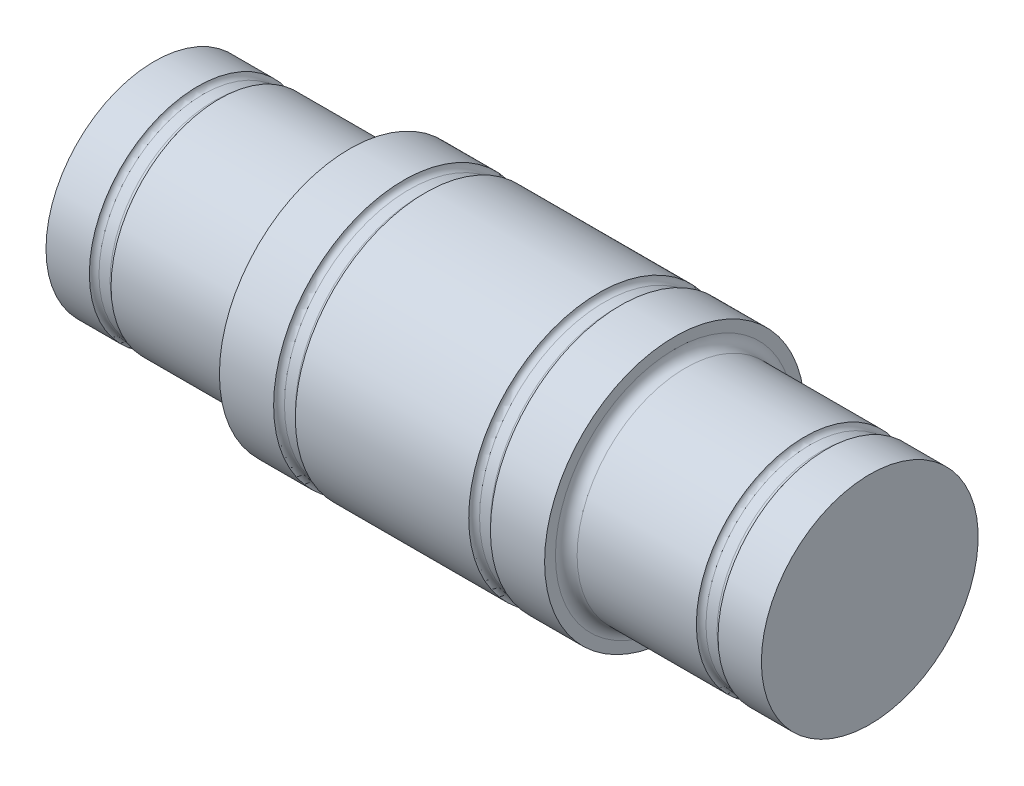
ISO-10303-21;
HEADER;
FILE_DESCRIPTION(('STEP AP214'),'2;1');
FILE_NAME('part.step','',(''),(''),'','','');
FILE_SCHEMA(('AUTOMOTIVE_DESIGN { 1 0 10303 214 1 1 1 1 }'));
ENDSEC;
DATA;
#1=APPLICATION_CONTEXT('core data for automotive mechanical design processes');
#2=APPLICATION_PROTOCOL_DEFINITION('international standard','automotive_design',2000,#1);
#3=PRODUCT_CONTEXT('',#1,'mechanical');
#4=PRODUCT('Part','Part','',(#3));
#5=PRODUCT_RELATED_PRODUCT_CATEGORY('part','',(#4));
#6=PRODUCT_DEFINITION_FORMATION('','',#4);
#7=PRODUCT_DEFINITION_CONTEXT('part definition',#1,'design');
#8=PRODUCT_DEFINITION('design','',#6,#7);
#9=PRODUCT_DEFINITION_SHAPE('','',#8);
#10=(LENGTH_UNIT() NAMED_UNIT(*) SI_UNIT(.MILLI.,.METRE.));
#11=(NAMED_UNIT(*) PLANE_ANGLE_UNIT() SI_UNIT($,.RADIAN.));
#12=(NAMED_UNIT(*) SI_UNIT($,.STERADIAN.) SOLID_ANGLE_UNIT());
#13=UNCERTAINTY_MEASURE_WITH_UNIT(LENGTH_MEASURE(1.E-05),#10,'distance_accuracy_value','');
#14=(GEOMETRIC_REPRESENTATION_CONTEXT(3) GLOBAL_UNCERTAINTY_ASSIGNED_CONTEXT((#13)) GLOBAL_UNIT_ASSIGNED_CONTEXT((#10,
#11,#12)) REPRESENTATION_CONTEXT('',''));
#15=CARTESIAN_POINT('',(0.,0.,0.));
#16=DIRECTION('',(0.,0.,1.));
#17=DIRECTION('',(1.,0.,0.));
#18=AXIS2_PLACEMENT_3D('',#15,#16,#17);
#19=CARTESIAN_POINT('',(-16.5,5.,0.));
#20=DIRECTION('',(1.,0.,0.));
#21=DIRECTION('',(0.,0.,-1.));
#22=AXIS2_PLACEMENT_3D('',#19,#20,#21);
#23=PLANE('',#22);
#24=CARTESIAN_POINT('',(-16.5,0.,0.));
#25=DIRECTION('',(-1.,0.,0.));
#26=DIRECTION('',(0.,0.,1.));
#27=AXIS2_PLACEMENT_3D('',#24,#25,#26);
#28=CIRCLE('',#27,5.);
#29=CARTESIAN_POINT('',(-16.5,0.,5.));
#30=VERTEX_POINT('',#29);
#31=EDGE_CURVE('E123',#30,#30,#28,.T.);
#32=ORIENTED_EDGE('',*,*,#31,.T.);
#33=EDGE_LOOP('',(#32));
#34=FACE_BOUND('',#33,.T.);
#35=ADVANCED_FACE('F46',(#34),#23,.F.);
#36=CARTESIAN_POINT('',(16.5,0.,0.));
#37=DIRECTION('',(-1.,0.,0.));
#38=DIRECTION('',(0.,0.,1.));
#39=AXIS2_PLACEMENT_3D('',#36,#37,#38);
#40=PLANE('',#39);
#41=CARTESIAN_POINT('',(16.5,0.,0.));
#42=DIRECTION('',(-1.,0.,0.));
#43=DIRECTION('',(0.,0.,1.));
#44=AXIS2_PLACEMENT_3D('',#41,#42,#43);
#45=CIRCLE('',#44,5.);
#46=CARTESIAN_POINT('',(16.5,0.,5.));
#47=VERTEX_POINT('',#46);
#48=EDGE_CURVE('E90',#47,#47,#45,.T.);
#49=ORIENTED_EDGE('',*,*,#48,.F.);
#50=EDGE_LOOP('',(#49));
#51=FACE_BOUND('',#50,.T.);
#52=ADVANCED_FACE('F145',(#51),#40,.F.);
#53=CARTESIAN_POINT('',(-16.5,0.,0.));
#54=DIRECTION('',(-1.,0.,0.));
#55=DIRECTION('',(0.,0.,1.));
#56=AXIS2_PLACEMENT_3D('',#53,#54,#55);
#57=CYLINDRICAL_SURFACE('',#56,5.);
#58=CARTESIAN_POINT('',(14.5,0.,0.));
#59=DIRECTION('',(-1.,0.,0.));
#60=DIRECTION('',(0.,0.,1.));
#61=AXIS2_PLACEMENT_3D('',#58,#59,#60);
#62=CIRCLE('',#61,5.);
#63=CARTESIAN_POINT('',(14.5,0.,5.));
#64=VERTEX_POINT('',#63);
#65=EDGE_CURVE('E93',#64,#64,#62,.T.);
#66=ORIENTED_EDGE('',*,*,#65,.F.);
#67=EDGE_LOOP('',(#66));
#68=FACE_BOUND('',#67,.T.);
#69=ORIENTED_EDGE('',*,*,#48,.T.);
#70=EDGE_LOOP('',(#69));
#71=FACE_BOUND('',#70,.T.);
#72=ADVANCED_FACE('F150',(#68,#71),#57,.T.);
#73=CARTESIAN_POINT('',(-16.5,0.,0.));
#74=DIRECTION('',(-1.,0.,0.));
#75=DIRECTION('',(0.,0.,1.));
#76=AXIS2_PLACEMENT_3D('',#73,#74,#75);
#77=CYLINDRICAL_SURFACE('',#76,4.8);
#78=CARTESIAN_POINT('',(14.2550510257217,0.,0.));
#79=DIRECTION('',(1.,0.,0.));
#80=DIRECTION('',(0.,0.,-1.));
#81=AXIS2_PLACEMENT_3D('',#78,#79,#80);
#82=CIRCLE('',#81,4.8);
#83=CARTESIAN_POINT('',(14.2550510257217,0.,-4.8));
#84=VERTEX_POINT('',#83);
#85=EDGE_CURVE('E57',#84,#84,#82,.F.);
#86=ORIENTED_EDGE('',*,*,#85,.T.);
#87=EDGE_LOOP('',(#86));
#88=FACE_BOUND('',#87,.T.);
#89=CARTESIAN_POINT('',(13.7449489742783,0.,0.));
#90=DIRECTION('',(-1.,0.,0.));
#91=DIRECTION('',(0.,0.,1.));
#92=AXIS2_PLACEMENT_3D('',#89,#90,#91);
#93=CIRCLE('',#92,4.8);
#94=CARTESIAN_POINT('',(13.7449489742783,0.,4.8));
#95=VERTEX_POINT('',#94);
#96=EDGE_CURVE('E61',#95,#95,#93,.F.);
#97=ORIENTED_EDGE('',*,*,#96,.T.);
#98=EDGE_LOOP('',(#97));
#99=FACE_BOUND('',#98,.T.);
#100=ADVANCED_FACE('F193',(#88,#99),#77,.T.);
#101=CARTESIAN_POINT('',(-16.5,0.,0.));
#102=DIRECTION('',(-1.,0.,0.));
#103=DIRECTION('',(0.,0.,1.));
#104=AXIS2_PLACEMENT_3D('',#101,#102,#103);
#105=CYLINDRICAL_SURFACE('',#104,5.);
#106=CARTESIAN_POINT('',(8.,0.,0.));
#107=DIRECTION('',(-1.,0.,0.));
#108=DIRECTION('',(0.,0.,1.));
#109=AXIS2_PLACEMENT_3D('',#106,#107,#108);
#110=CIRCLE('',#109,5.);
#111=CARTESIAN_POINT('',(8.,0.,5.));
#112=VERTEX_POINT('',#111);
#113=EDGE_CURVE('E84',#112,#112,#110,.F.);
#114=ORIENTED_EDGE('',*,*,#113,.T.);
#115=EDGE_LOOP('',(#114));
#116=FACE_BOUND('',#115,.T.);
#117=CARTESIAN_POINT('',(13.5,0.,0.));
#118=DIRECTION('',(-1.,0.,0.));
#119=DIRECTION('',(0.,0.,1.));
#120=AXIS2_PLACEMENT_3D('',#117,#118,#119);
#121=CIRCLE('',#120,5.);
#122=CARTESIAN_POINT('',(13.5,0.,5.));
#123=VERTEX_POINT('',#122);
#124=EDGE_CURVE('E96',#123,#123,#121,.T.);
#125=ORIENTED_EDGE('',*,*,#124,.T.);
#126=EDGE_LOOP('',(#125));
#127=FACE_BOUND('',#126,.T.);
#128=ADVANCED_FACE('F190',(#116,#127),#105,.T.);
#129=CARTESIAN_POINT('',(7.5,5.,0.));
#130=DIRECTION('',(-1.,0.,0.));
#131=DIRECTION('',(0.,0.,1.));
#132=AXIS2_PLACEMENT_3D('',#129,#130,#131);
#133=PLANE('',#132);
#134=CARTESIAN_POINT('',(7.5,0.,0.));
#135=DIRECTION('',(-1.,0.,0.));
#136=DIRECTION('',(0.,0.,1.));
#137=AXIS2_PLACEMENT_3D('',#134,#135,#136);
#138=CIRCLE('',#137,5.5);
#139=CARTESIAN_POINT('',(7.5,0.,5.5));
#140=VERTEX_POINT('',#139);
#141=EDGE_CURVE('E87',#140,#140,#138,.T.);
#142=ORIENTED_EDGE('',*,*,#141,.T.);
#143=EDGE_LOOP('',(#142));
#144=FACE_BOUND('',#143,.T.);
#145=CARTESIAN_POINT('',(7.5,0.,0.));
#146=DIRECTION('',(-1.,0.,0.));
#147=DIRECTION('',(0.,0.,1.));
#148=AXIS2_PLACEMENT_3D('',#145,#146,#147);
#149=CIRCLE('',#148,6.);
#150=CARTESIAN_POINT('',(7.5,0.,6.));
#151=VERTEX_POINT('',#150);
#152=EDGE_CURVE('E99',#151,#151,#149,.T.);
#153=ORIENTED_EDGE('',*,*,#152,.F.);
#154=EDGE_LOOP('',(#153));
#155=FACE_BOUND('',#154,.T.);
#156=ADVANCED_FACE('F192',(#144,#155),#133,.F.);
#157=CARTESIAN_POINT('',(-16.5,0.,0.));
#158=DIRECTION('',(-1.,0.,0.));
#159=DIRECTION('',(0.,0.,1.));
#160=AXIS2_PLACEMENT_3D('',#157,#158,#159);
#161=CYLINDRICAL_SURFACE('',#160,6.);
#162=CARTESIAN_POINT('',(5.,0.,0.));
#163=DIRECTION('',(-1.,0.,0.));
#164=DIRECTION('',(0.,0.,1.));
#165=AXIS2_PLACEMENT_3D('',#162,#163,#164);
#166=CIRCLE('',#165,6.);
#167=CARTESIAN_POINT('',(5.,0.,6.));
#168=VERTEX_POINT('',#167);
#169=EDGE_CURVE('E102',#168,#168,#166,.T.);
#170=ORIENTED_EDGE('',*,*,#169,.F.);
#171=EDGE_LOOP('',(#170));
#172=FACE_BOUND('',#171,.T.);
#173=ORIENTED_EDGE('',*,*,#152,.T.);
#174=EDGE_LOOP('',(#173));
#175=FACE_BOUND('',#174,.T.);
#176=ADVANCED_FACE('F200',(#172,#175),#161,.T.);
#177=CARTESIAN_POINT('',(-16.5,0.,0.));
#178=DIRECTION('',(-1.,0.,0.));
#179=DIRECTION('',(0.,0.,1.));
#180=AXIS2_PLACEMENT_3D('',#177,#178,#179);
#181=CYLINDRICAL_SURFACE('',#180,5.75);
#182=CARTESIAN_POINT('',(4.25,0.,0.));
#183=DIRECTION('',(-1.,0.,0.));
#184=DIRECTION('',(0.,0.,1.));
#185=AXIS2_PLACEMENT_3D('',#182,#183,#184);
#186=CIRCLE('',#185,5.75);
#187=CARTESIAN_POINT('',(4.25,0.,5.75));
#188=VERTEX_POINT('',#187);
#189=EDGE_CURVE('E66',#188,#188,#186,.F.);
#190=ORIENTED_EDGE('',*,*,#189,.T.);
#191=EDGE_LOOP('',(#190));
#192=FACE_BOUND('',#191,.T.);
#193=CARTESIAN_POINT('',(4.75,0.,0.));
#194=DIRECTION('',(1.,0.,0.));
#195=DIRECTION('',(0.,0.,-1.));
#196=AXIS2_PLACEMENT_3D('',#193,#194,#195);
#197=CIRCLE('',#196,5.75);
#198=CARTESIAN_POINT('',(4.75,0.,-5.75));
#199=VERTEX_POINT('',#198);
#200=EDGE_CURVE('E69',#199,#199,#197,.F.);
#201=ORIENTED_EDGE('',*,*,#200,.T.);
#202=EDGE_LOOP('',(#201));
#203=FACE_BOUND('',#202,.T.);
#204=ADVANCED_FACE('F308',(#192,#203),#181,.T.);
#205=CARTESIAN_POINT('',(-16.5,0.,0.));
#206=DIRECTION('',(-1.,0.,0.));
#207=DIRECTION('',(0.,0.,1.));
#208=AXIS2_PLACEMENT_3D('',#205,#206,#207);
#209=CYLINDRICAL_SURFACE('',#208,6.);
#210=CARTESIAN_POINT('',(-4.,0.,0.));
#211=DIRECTION('',(-1.,0.,0.));
#212=DIRECTION('',(0.,0.,1.));
#213=AXIS2_PLACEMENT_3D('',#210,#211,#212);
#214=CIRCLE('',#213,6.);
#215=CARTESIAN_POINT('',(-4.,0.,6.));
#216=VERTEX_POINT('',#215);
#217=EDGE_CURVE('E108',#216,#216,#214,.T.);
#218=ORIENTED_EDGE('',*,*,#217,.F.);
#219=EDGE_LOOP('',(#218));
#220=FACE_BOUND('',#219,.T.);
#221=CARTESIAN_POINT('',(4.,0.,0.));
#222=DIRECTION('',(-1.,0.,0.));
#223=DIRECTION('',(0.,0.,1.));
#224=AXIS2_PLACEMENT_3D('',#221,#222,#223);
#225=CIRCLE('',#224,6.);
#226=CARTESIAN_POINT('',(4.,0.,6.));
#227=VERTEX_POINT('',#226);
#228=EDGE_CURVE('E105',#227,#227,#225,.T.);
#229=ORIENTED_EDGE('',*,*,#228,.T.);
#230=EDGE_LOOP('',(#229));
#231=FACE_BOUND('',#230,.T.);
#232=ADVANCED_FACE('F314',(#220,#231),#209,.T.);
#233=CARTESIAN_POINT('',(-16.5,0.,0.));
#234=DIRECTION('',(-1.,0.,0.));
#235=DIRECTION('',(0.,0.,1.));
#236=AXIS2_PLACEMENT_3D('',#233,#234,#235);
#237=CYLINDRICAL_SURFACE('',#236,5.75);
#238=CARTESIAN_POINT('',(-4.25,0.,0.));
#239=DIRECTION('',(1.,0.,0.));
#240=DIRECTION('',(0.,0.,-1.));
#241=AXIS2_PLACEMENT_3D('',#238,#239,#240);
#242=CIRCLE('',#241,5.75);
#243=CARTESIAN_POINT('',(-4.25,0.,-5.75));
#244=VERTEX_POINT('',#243);
#245=EDGE_CURVE('E72',#244,#244,#242,.F.);
#246=ORIENTED_EDGE('',*,*,#245,.T.);
#247=EDGE_LOOP('',(#246));
#248=FACE_BOUND('',#247,.T.);
#249=CARTESIAN_POINT('',(-4.75,0.,0.));
#250=DIRECTION('',(-1.,0.,0.));
#251=DIRECTION('',(0.,0.,1.));
#252=AXIS2_PLACEMENT_3D('',#249,#250,#251);
#253=CIRCLE('',#252,5.75);
#254=CARTESIAN_POINT('',(-4.75,0.,5.75));
#255=VERTEX_POINT('',#254);
#256=EDGE_CURVE('E75',#255,#255,#253,.F.);
#257=ORIENTED_EDGE('',*,*,#256,.T.);
#258=EDGE_LOOP('',(#257));
#259=FACE_BOUND('',#258,.T.);
#260=ADVANCED_FACE('F321',(#248,#259),#237,.T.);
#261=CARTESIAN_POINT('',(-16.5,0.,0.));
#262=DIRECTION('',(-1.,0.,0.));
#263=DIRECTION('',(0.,0.,1.));
#264=AXIS2_PLACEMENT_3D('',#261,#262,#263);
#265=CYLINDRICAL_SURFACE('',#264,6.);
#266=CARTESIAN_POINT('',(-7.5,0.,0.));
#267=DIRECTION('',(-1.,0.,0.));
#268=DIRECTION('',(0.,0.,1.));
#269=AXIS2_PLACEMENT_3D('',#266,#267,#268);
#270=CIRCLE('',#269,6.);
#271=CARTESIAN_POINT('',(-7.5,0.,6.));
#272=VERTEX_POINT('',#271);
#273=EDGE_CURVE('E114',#272,#272,#270,.T.);
#274=ORIENTED_EDGE('',*,*,#273,.F.);
#275=EDGE_LOOP('',(#274));
#276=FACE_BOUND('',#275,.T.);
#277=CARTESIAN_POINT('',(-5.,0.,0.));
#278=DIRECTION('',(-1.,0.,0.));
#279=DIRECTION('',(0.,0.,1.));
#280=AXIS2_PLACEMENT_3D('',#277,#278,#279);
#281=CIRCLE('',#280,6.);
#282=CARTESIAN_POINT('',(-5.,0.,6.));
#283=VERTEX_POINT('',#282);
#284=EDGE_CURVE('E111',#283,#283,#281,.T.);
#285=ORIENTED_EDGE('',*,*,#284,.T.);
#286=EDGE_LOOP('',(#285));
#287=FACE_BOUND('',#286,.T.);
#288=ADVANCED_FACE('F286',(#276,#287),#265,.T.);
#289=CARTESIAN_POINT('',(-7.5,6.,0.));
#290=DIRECTION('',(1.,0.,0.));
#291=DIRECTION('',(0.,0.,-1.));
#292=AXIS2_PLACEMENT_3D('',#289,#290,#291);
#293=PLANE('',#292);
#294=CARTESIAN_POINT('',(-7.5,0.,0.));
#295=DIRECTION('',(1.,0.,0.));
#296=DIRECTION('',(0.,0.,-1.));
#297=AXIS2_PLACEMENT_3D('',#294,#295,#296);
#298=CIRCLE('',#297,5.5);
#299=CARTESIAN_POINT('',(-7.5,0.,-5.5));
#300=VERTEX_POINT('',#299);
#301=EDGE_CURVE('E78',#300,#300,#298,.T.);
#302=ORIENTED_EDGE('',*,*,#301,.T.);
#303=EDGE_LOOP('',(#302));
#304=FACE_BOUND('',#303,.T.);
#305=ORIENTED_EDGE('',*,*,#273,.T.);
#306=EDGE_LOOP('',(#305));
#307=FACE_BOUND('',#306,.T.);
#308=ADVANCED_FACE('F228',(#304,#307),#293,.F.);
#309=CARTESIAN_POINT('',(-16.5,0.,0.));
#310=DIRECTION('',(-1.,0.,0.));
#311=DIRECTION('',(0.,0.,1.));
#312=AXIS2_PLACEMENT_3D('',#309,#310,#311);
#313=CYLINDRICAL_SURFACE('',#312,5.);
#314=CARTESIAN_POINT('',(-8.,0.,0.));
#315=DIRECTION('',(1.,0.,0.));
#316=DIRECTION('',(0.,0.,-1.));
#317=AXIS2_PLACEMENT_3D('',#314,#315,#316);
#318=CIRCLE('',#317,5.);
#319=CARTESIAN_POINT('',(-8.,0.,-5.));
#320=VERTEX_POINT('',#319);
#321=EDGE_CURVE('E81',#320,#320,#318,.F.);
#322=ORIENTED_EDGE('',*,*,#321,.T.);
#323=EDGE_LOOP('',(#322));
#324=FACE_BOUND('',#323,.T.);
#325=CARTESIAN_POINT('',(-13.5,0.,0.));
#326=DIRECTION('',(-1.,0.,0.));
#327=DIRECTION('',(0.,0.,1.));
#328=AXIS2_PLACEMENT_3D('',#325,#326,#327);
#329=CIRCLE('',#328,5.);
#330=CARTESIAN_POINT('',(-13.5,0.,5.));
#331=VERTEX_POINT('',#330);
#332=EDGE_CURVE('E117',#331,#331,#329,.T.);
#333=ORIENTED_EDGE('',*,*,#332,.F.);
#334=EDGE_LOOP('',(#333));
#335=FACE_BOUND('',#334,.T.);
#336=ADVANCED_FACE('F225',(#324,#335),#313,.T.);
#337=CARTESIAN_POINT('',(-16.5,0.,0.));
#338=DIRECTION('',(-1.,0.,0.));
#339=DIRECTION('',(0.,0.,1.));
#340=AXIS2_PLACEMENT_3D('',#337,#338,#339);
#341=CYLINDRICAL_SURFACE('',#340,4.8);
#342=CARTESIAN_POINT('',(-13.7449489742783,0.,0.));
#343=DIRECTION('',(1.,0.,0.));
#344=DIRECTION('',(0.,0.,-1.));
#345=AXIS2_PLACEMENT_3D('',#342,#343,#344);
#346=CIRCLE('',#345,4.8);
#347=CARTESIAN_POINT('',(-13.7449489742783,0.,-4.8));
#348=VERTEX_POINT('',#347);
#349=EDGE_CURVE('E11',#348,#348,#346,.F.);
#350=ORIENTED_EDGE('',*,*,#349,.T.);
#351=EDGE_LOOP('',(#350));
#352=FACE_BOUND('',#351,.T.);
#353=CARTESIAN_POINT('',(-14.2550510257217,0.,0.));
#354=DIRECTION('',(-1.,0.,0.));
#355=DIRECTION('',(0.,0.,1.));
#356=AXIS2_PLACEMENT_3D('',#353,#354,#355);
#357=CIRCLE('',#356,4.8);
#358=CARTESIAN_POINT('',(-14.2550510257217,0.,4.8));
#359=VERTEX_POINT('',#358);
#360=EDGE_CURVE('E53',#359,#359,#357,.F.);
#361=ORIENTED_EDGE('',*,*,#360,.T.);
#362=EDGE_LOOP('',(#361));
#363=FACE_BOUND('',#362,.T.);
#364=ADVANCED_FACE('F132',(#352,#363),#341,.T.);
#365=CARTESIAN_POINT('',(-16.5,0.,0.));
#366=DIRECTION('',(-1.,0.,0.));
#367=DIRECTION('',(0.,0.,1.));
#368=AXIS2_PLACEMENT_3D('',#365,#366,#367);
#369=CYLINDRICAL_SURFACE('',#368,5.);
#370=ORIENTED_EDGE('',*,*,#31,.F.);
#371=EDGE_LOOP('',(#370));
#372=FACE_BOUND('',#371,.T.);
#373=CARTESIAN_POINT('',(-14.5,0.,0.));
#374=DIRECTION('',(-1.,0.,0.));
#375=DIRECTION('',(0.,0.,1.));
#376=AXIS2_PLACEMENT_3D('',#373,#374,#375);
#377=CIRCLE('',#376,5.);
#378=CARTESIAN_POINT('',(-14.5,0.,5.));
#379=VERTEX_POINT('',#378);
#380=EDGE_CURVE('E120',#379,#379,#377,.T.);
#381=ORIENTED_EDGE('',*,*,#380,.T.);
#382=EDGE_LOOP('',(#381));
#383=FACE_BOUND('',#382,.T.);
#384=ADVANCED_FACE('F128',(#372,#383),#369,.T.);
#385=CARTESIAN_POINT('',(8.,0.,0.));
#386=DIRECTION('',(-1.,0.,0.));
#387=DIRECTION('',(0.,0.,1.));
#388=AXIS2_PLACEMENT_3D('',#385,#386,#387);
#389=TOROIDAL_SURFACE('',#388,5.5,0.5);
#390=ORIENTED_EDGE('',*,*,#113,.F.);
#391=EDGE_LOOP('',(#390));
#392=FACE_BOUND('',#391,.T.);
#393=ORIENTED_EDGE('',*,*,#141,.F.);
#394=EDGE_LOOP('',(#393));
#395=FACE_BOUND('',#394,.T.);
#396=ADVANCED_FACE('F131',(#392,#395),#389,.F.);
#397=CARTESIAN_POINT('',(-8.,0.,0.));
#398=DIRECTION('',(1.,0.,0.));
#399=DIRECTION('',(0.,0.,-1.));
#400=AXIS2_PLACEMENT_3D('',#397,#398,#399);
#401=TOROIDAL_SURFACE('',#400,5.5,0.5);
#402=ORIENTED_EDGE('',*,*,#301,.F.);
#403=EDGE_LOOP('',(#402));
#404=FACE_BOUND('',#403,.T.);
#405=ORIENTED_EDGE('',*,*,#321,.F.);
#406=EDGE_LOOP('',(#405));
#407=FACE_BOUND('',#406,.T.);
#408=ADVANCED_FACE('F157',(#404,#407),#401,.F.);
#409=CARTESIAN_POINT('',(-4.25,0.,0.));
#410=DIRECTION('',(1.,0.,0.));
#411=DIRECTION('',(0.,0.,-1.));
#412=AXIS2_PLACEMENT_3D('',#409,#410,#411);
#413=TOROIDAL_SURFACE('',#412,6.,0.25);
#414=ORIENTED_EDGE('',*,*,#217,.T.);
#415=EDGE_LOOP('',(#414));
#416=FACE_BOUND('',#415,.T.);
#417=ORIENTED_EDGE('',*,*,#245,.F.);
#418=EDGE_LOOP('',(#417));
#419=FACE_BOUND('',#418,.T.);
#420=ADVANCED_FACE('F161',(#416,#419),#413,.F.);
#421=CARTESIAN_POINT('',(-4.75,0.,0.));
#422=DIRECTION('',(-1.,0.,0.));
#423=DIRECTION('',(0.,0.,1.));
#424=AXIS2_PLACEMENT_3D('',#421,#422,#423);
#425=TOROIDAL_SURFACE('',#424,6.,0.25);
#426=ORIENTED_EDGE('',*,*,#256,.F.);
#427=EDGE_LOOP('',(#426));
#428=FACE_BOUND('',#427,.T.);
#429=ORIENTED_EDGE('',*,*,#284,.F.);
#430=EDGE_LOOP('',(#429));
#431=FACE_BOUND('',#430,.T.);
#432=ADVANCED_FACE('F165',(#428,#431),#425,.F.);
#433=CARTESIAN_POINT('',(4.25,0.,0.));
#434=DIRECTION('',(-1.,0.,0.));
#435=DIRECTION('',(0.,0.,1.));
#436=AXIS2_PLACEMENT_3D('',#433,#434,#435);
#437=TOROIDAL_SURFACE('',#436,6.,0.25);
#438=ORIENTED_EDGE('',*,*,#189,.F.);
#439=EDGE_LOOP('',(#438));
#440=FACE_BOUND('',#439,.T.);
#441=ORIENTED_EDGE('',*,*,#228,.F.);
#442=EDGE_LOOP('',(#441));
#443=FACE_BOUND('',#442,.T.);
#444=ADVANCED_FACE('F169',(#440,#443),#437,.F.);
#445=CARTESIAN_POINT('',(4.75,0.,0.));
#446=DIRECTION('',(1.,0.,0.));
#447=DIRECTION('',(0.,0.,-1.));
#448=AXIS2_PLACEMENT_3D('',#445,#446,#447);
#449=TOROIDAL_SURFACE('',#448,6.,0.25);
#450=ORIENTED_EDGE('',*,*,#169,.T.);
#451=EDGE_LOOP('',(#450));
#452=FACE_BOUND('',#451,.T.);
#453=ORIENTED_EDGE('',*,*,#200,.F.);
#454=EDGE_LOOP('',(#453));
#455=FACE_BOUND('',#454,.T.);
#456=ADVANCED_FACE('F173',(#452,#455),#449,.F.);
#457=CARTESIAN_POINT('',(14.2550510257217,0.,0.));
#458=DIRECTION('',(1.,0.,0.));
#459=DIRECTION('',(0.,0.,-1.));
#460=AXIS2_PLACEMENT_3D('',#457,#458,#459);
#461=TOROIDAL_SURFACE('',#460,5.05,0.25);
#462=ORIENTED_EDGE('',*,*,#65,.T.);
#463=EDGE_LOOP('',(#462));
#464=FACE_BOUND('',#463,.T.);
#465=ORIENTED_EDGE('',*,*,#85,.F.);
#466=EDGE_LOOP('',(#465));
#467=FACE_BOUND('',#466,.T.);
#468=ADVANCED_FACE('F177',(#464,#467),#461,.F.);
#469=CARTESIAN_POINT('',(13.7449489742783,0.,0.));
#470=DIRECTION('',(-1.,0.,0.));
#471=DIRECTION('',(0.,0.,1.));
#472=AXIS2_PLACEMENT_3D('',#469,#470,#471);
#473=TOROIDAL_SURFACE('',#472,5.05,0.25);
#474=ORIENTED_EDGE('',*,*,#96,.F.);
#475=EDGE_LOOP('',(#474));
#476=FACE_BOUND('',#475,.T.);
#477=ORIENTED_EDGE('',*,*,#124,.F.);
#478=EDGE_LOOP('',(#477));
#479=FACE_BOUND('',#478,.T.);
#480=ADVANCED_FACE('F142',(#476,#479),#473,.F.);
#481=CARTESIAN_POINT('',(-13.7449489742783,0.,0.));
#482=DIRECTION('',(1.,0.,0.));
#483=DIRECTION('',(0.,0.,-1.));
#484=AXIS2_PLACEMENT_3D('',#481,#482,#483);
#485=TOROIDAL_SURFACE('',#484,5.05,0.25);
#486=ORIENTED_EDGE('',*,*,#332,.T.);
#487=EDGE_LOOP('',(#486));
#488=FACE_BOUND('',#487,.T.);
#489=ORIENTED_EDGE('',*,*,#349,.F.);
#490=EDGE_LOOP('',(#489));
#491=FACE_BOUND('',#490,.T.);
#492=ADVANCED_FACE('F137',(#488,#491),#485,.F.);
#493=CARTESIAN_POINT('',(-14.2550510257217,0.,0.));
#494=DIRECTION('',(-1.,0.,0.));
#495=DIRECTION('',(0.,0.,1.));
#496=AXIS2_PLACEMENT_3D('',#493,#494,#495);
#497=TOROIDAL_SURFACE('',#496,5.05,0.25);
#498=ORIENTED_EDGE('',*,*,#360,.F.);
#499=EDGE_LOOP('',(#498));
#500=FACE_BOUND('',#499,.T.);
#501=ORIENTED_EDGE('',*,*,#380,.F.);
#502=EDGE_LOOP('',(#501));
#503=FACE_BOUND('',#502,.T.);
#504=ADVANCED_FACE('F48',(#500,#503),#497,.F.);
#505=CLOSED_SHELL('',(#35,#52,#72,#100,#128,#156,#176,#204,#232,#260,#288,#308,#336,#364,#384,
#396,#408,#420,#432,#444,#456,#468,#480,#492,#504));
#506=MANIFOLD_SOLID_BREP('B2',#505);
#507=ADVANCED_BREP_SHAPE_REPRESENTATION('',(#18,#506),#14);
#508=SHAPE_DEFINITION_REPRESENTATION(#9,#507);
ENDSEC;
END-ISO-10303-21;
